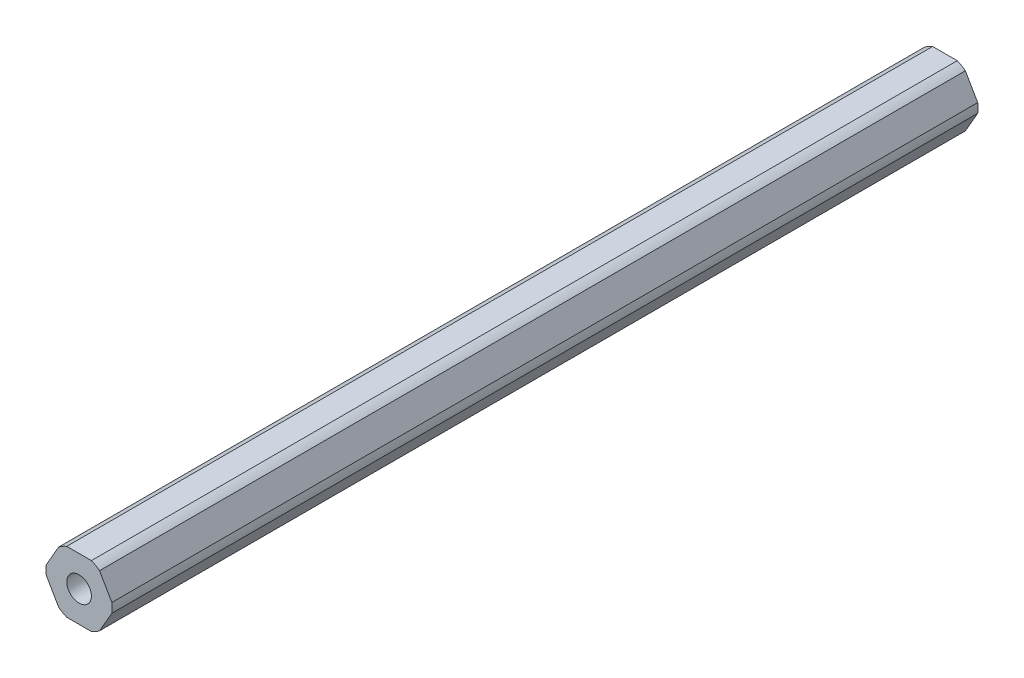
ISO-10303-21;
HEADER;
FILE_DESCRIPTION(('STEP AP214'),'2;1');
FILE_NAME('part.step','',(''),(''),'','','');
FILE_SCHEMA(('AUTOMOTIVE_DESIGN { 1 0 10303 214 1 1 1 1 }'));
ENDSEC;
DATA;
#1=APPLICATION_CONTEXT('core data for automotive mechanical design processes');
#2=APPLICATION_PROTOCOL_DEFINITION('international standard','automotive_design',2000,#1);
#3=PRODUCT_CONTEXT('',#1,'mechanical');
#4=PRODUCT('Part','Part','',(#3));
#5=PRODUCT_RELATED_PRODUCT_CATEGORY('part','',(#4));
#6=PRODUCT_DEFINITION_FORMATION('','',#4);
#7=PRODUCT_DEFINITION_CONTEXT('part definition',#1,'design');
#8=PRODUCT_DEFINITION('design','',#6,#7);
#9=PRODUCT_DEFINITION_SHAPE('','',#8);
#10=(LENGTH_UNIT() NAMED_UNIT(*) SI_UNIT(.MILLI.,.METRE.));
#11=(NAMED_UNIT(*) PLANE_ANGLE_UNIT() SI_UNIT($,.RADIAN.));
#12=(NAMED_UNIT(*) SI_UNIT($,.STERADIAN.) SOLID_ANGLE_UNIT());
#13=UNCERTAINTY_MEASURE_WITH_UNIT(LENGTH_MEASURE(1.E-05),#10,'distance_accuracy_value','');
#14=(GEOMETRIC_REPRESENTATION_CONTEXT(3) GLOBAL_UNCERTAINTY_ASSIGNED_CONTEXT((#13)) GLOBAL_UNIT_ASSIGNED_CONTEXT((#10,
#11,#12)) REPRESENTATION_CONTEXT('',''));
#15=CARTESIAN_POINT('',(0.,0.,0.));
#16=DIRECTION('',(0.,0.,1.));
#17=DIRECTION('',(1.,0.,0.));
#18=AXIS2_PLACEMENT_3D('',#15,#16,#17);
#19=CARTESIAN_POINT('',(0.,0.,-457.2));
#20=DIRECTION('',(0.,0.,1.));
#21=DIRECTION('',(1.,0.,0.));
#22=AXIS2_PLACEMENT_3D('',#19,#20,#21);
#23=CYLINDRICAL_SURFACE('',#22,6.87);
#24=CARTESIAN_POINT('',(0.,0.,277.588702492338));
#25=DIRECTION('',(0.,0.,1.));
#26=DIRECTION('',(1.,0.,0.));
#27=AXIS2_PLACEMENT_3D('',#24,#25,#26);
#28=CIRCLE('',#27,6.87);
#29=CARTESIAN_POINT('',(6.80102150534208,0.97108520937895,277.588702492338));
#30=VERTEX_POINT('',#29);
#31=CARTESIAN_POINT('',(6.80102150534208,-0.971085209378955,277.588702492338));
#32=VERTEX_POINT('',#31);
#33=EDGE_CURVE('E205',#30,#32,#28,.F.);
#34=ORIENTED_EDGE('',*,*,#33,.F.);
#35=DIRECTION('',(0.,0.,1.));
#36=VECTOR('',#35,1.);
#37=CARTESIAN_POINT('',(6.80102150534208,0.97108520937895,457.2));
#38=LINE('',#37,#36);
#39=CARTESIAN_POINT('',(6.80102150534208,0.971085209378948,457.2));
#40=VERTEX_POINT('',#39);
#41=EDGE_CURVE('E184',#30,#40,#38,.T.);
#42=ORIENTED_EDGE('',*,*,#41,.T.);
#43=CARTESIAN_POINT('',(0.,0.,457.2));
#44=DIRECTION('',(0.,0.,1.));
#45=DIRECTION('',(1.,0.,0.));
#46=AXIS2_PLACEMENT_3D('',#43,#44,#45);
#47=CIRCLE('',#46,6.87);
#48=CARTESIAN_POINT('',(6.80102150534208,-0.971085209378954,457.2));
#49=VERTEX_POINT('',#48);
#50=EDGE_CURVE('E234',#40,#49,#47,.F.);
#51=ORIENTED_EDGE('',*,*,#50,.T.);
#52=DIRECTION('',(0.,0.,1.));
#53=VECTOR('',#52,1.);
#54=CARTESIAN_POINT('',(6.80102150534208,-0.971085209378955,457.2));
#55=LINE('',#54,#53);
#56=EDGE_CURVE('E264',#49,#32,#55,.F.);
#57=ORIENTED_EDGE('',*,*,#56,.T.);
#58=EDGE_LOOP('',(#34,#42,#51,#57));
#59=FACE_BOUND('',#58,.T.);
#60=ADVANCED_FACE('F56',(#59),#23,.T.);
#61=CARTESIAN_POINT('',(3.68083890619154,6.3754,457.2));
#62=DIRECTION('',(0.,-1.,0.));
#63=DIRECTION('',(1.,0.,0.));
#64=AXIS2_PLACEMENT_3D('',#61,#62,#63);
#65=PLANE('',#64);
#66=DIRECTION('',(0.,0.,1.));
#67=VECTOR('',#66,1.);
#68=CARTESIAN_POINT('',(2.55952629210953,6.37540000000001,-457.2));
#69=LINE('',#68,#67);
#70=CARTESIAN_POINT('',(2.55952629210953,6.37540000000001,277.588702492338));
#71=VERTEX_POINT('',#70);
#72=CARTESIAN_POINT('',(2.55952629210953,6.37540000000001,457.2));
#73=VERTEX_POINT('',#72);
#74=EDGE_CURVE('E183',#71,#73,#69,.T.);
#75=ORIENTED_EDGE('',*,*,#74,.F.);
#76=DIRECTION('',(-1.,0.,0.));
#77=VECTOR('',#76,1.);
#78=CARTESIAN_POINT('',(3.68083890619154,6.3754,277.588702492338));
#79=LINE('',#78,#77);
#80=CARTESIAN_POINT('',(-2.55952629210953,6.37540000000001,277.588702492338));
#81=VERTEX_POINT('',#80);
#82=EDGE_CURVE('E76',#71,#81,#79,.T.);
#83=ORIENTED_EDGE('',*,*,#82,.T.);
#84=DIRECTION('',(0.,0.,1.));
#85=VECTOR('',#84,1.);
#86=CARTESIAN_POINT('',(-2.55952629210953,6.37540000000001,-457.2));
#87=LINE('',#86,#85);
#88=CARTESIAN_POINT('',(-2.55952629210953,6.37540000000001,457.2));
#89=VERTEX_POINT('',#88);
#90=EDGE_CURVE('E289',#89,#81,#87,.F.);
#91=ORIENTED_EDGE('',*,*,#90,.F.);
#92=DIRECTION('',(1.,0.,0.));
#93=VECTOR('',#92,1.);
#94=CARTESIAN_POINT('',(0.,6.3754,457.2));
#95=LINE('',#94,#93);
#96=EDGE_CURVE('E251',#73,#89,#95,.F.);
#97=ORIENTED_EDGE('',*,*,#96,.F.);
#98=EDGE_LOOP('',(#75,#83,#91,#97));
#99=FACE_BOUND('',#98,.T.);
#100=ADVANCED_FACE('F345',(#99),#65,.F.);
#101=CARTESIAN_POINT('',(0.,0.,-457.2));
#102=DIRECTION('',(0.,0.,1.));
#103=DIRECTION('',(1.,0.,0.));
#104=AXIS2_PLACEMENT_3D('',#101,#102,#103);
#105=CYLINDRICAL_SURFACE('',#104,6.87);
#106=CARTESIAN_POINT('',(0.,0.,277.588702492338));
#107=DIRECTION('',(0.,0.,1.));
#108=DIRECTION('',(1.,0.,0.));
#109=AXIS2_PLACEMENT_3D('',#106,#107,#108);
#110=CIRCLE('',#109,6.87);
#111=CARTESIAN_POINT('',(-4.24149521323255,5.40431479062104,277.588702492338));
#112=VERTEX_POINT('',#111);
#113=EDGE_CURVE('E84',#112,#81,#110,.F.);
#114=ORIENTED_EDGE('',*,*,#113,.F.);
#115=DIRECTION('',(0.,0.,1.));
#116=VECTOR('',#115,1.);
#117=CARTESIAN_POINT('',(-4.24149521323255,5.40431479062104,457.2));
#118=LINE('',#117,#116);
#119=CARTESIAN_POINT('',(-4.24149521323255,5.40431479062105,457.2));
#120=VERTEX_POINT('',#119);
#121=EDGE_CURVE('E286',#112,#120,#118,.T.);
#122=ORIENTED_EDGE('',*,*,#121,.T.);
#123=CARTESIAN_POINT('',(0.,0.,457.2));
#124=DIRECTION('',(0.,0.,1.));
#125=DIRECTION('',(1.,0.,0.));
#126=AXIS2_PLACEMENT_3D('',#123,#124,#125);
#127=CIRCLE('',#126,6.87);
#128=EDGE_CURVE('E250',#89,#120,#127,.T.);
#129=ORIENTED_EDGE('',*,*,#128,.F.);
#130=ORIENTED_EDGE('',*,*,#90,.T.);
#131=EDGE_LOOP('',(#114,#122,#129,#130));
#132=FACE_BOUND('',#131,.T.);
#133=ADVANCED_FACE('F343',(#132),#105,.T.);
#134=CARTESIAN_POINT('',(-3.68083890619154,6.3754,457.2));
#135=DIRECTION('',(0.866025403784439,-0.5,0.));
#136=DIRECTION('',(0.5,0.866025403784439,0.));
#137=AXIS2_PLACEMENT_3D('',#134,#135,#136);
#138=PLANE('',#137);
#139=ORIENTED_EDGE('',*,*,#121,.F.);
#140=DIRECTION('',(-0.5,-0.866025403784439,0.));
#141=VECTOR('',#140,1.);
#142=CARTESIAN_POINT('',(-3.68083890619154,6.3754,277.588702492338));
#143=LINE('',#142,#141);
#144=CARTESIAN_POINT('',(-6.80102150534208,0.971085209378959,277.588702492338));
#145=VERTEX_POINT('',#144);
#146=EDGE_CURVE('E229',#112,#145,#143,.T.);
#147=ORIENTED_EDGE('',*,*,#146,.T.);
#148=DIRECTION('',(0.,0.,1.));
#149=VECTOR('',#148,1.);
#150=CARTESIAN_POINT('',(-6.80102150534208,0.971085209378959,-457.2));
#151=LINE('',#150,#149);
#152=CARTESIAN_POINT('',(-6.80102150534208,0.971085209378961,457.2));
#153=VERTEX_POINT('',#152);
#154=EDGE_CURVE('E282',#153,#145,#151,.F.);
#155=ORIENTED_EDGE('',*,*,#154,.F.);
#156=DIRECTION('',(-0.5,-0.866025403784439,0.));
#157=VECTOR('',#156,1.);
#158=CARTESIAN_POINT('',(-4.24149521323255,5.40431479062104,457.2));
#159=LINE('',#158,#157);
#160=EDGE_CURVE('E247',#120,#153,#159,.T.);
#161=ORIENTED_EDGE('',*,*,#160,.F.);
#162=EDGE_LOOP('',(#139,#147,#155,#161));
#163=FACE_BOUND('',#162,.T.);
#164=ADVANCED_FACE('F341',(#163),#138,.F.);
#165=CARTESIAN_POINT('',(0.,0.,-457.2));
#166=DIRECTION('',(0.,0.,1.));
#167=DIRECTION('',(1.,0.,0.));
#168=AXIS2_PLACEMENT_3D('',#165,#166,#167);
#169=CYLINDRICAL_SURFACE('',#168,6.87);
#170=CARTESIAN_POINT('',(0.,0.,277.588702492338));
#171=DIRECTION('',(0.,0.,1.));
#172=DIRECTION('',(1.,0.,0.));
#173=AXIS2_PLACEMENT_3D('',#170,#171,#172);
#174=CIRCLE('',#173,6.87);
#175=CARTESIAN_POINT('',(-6.80102150534208,-0.971085209378956,277.588702492338));
#176=VERTEX_POINT('',#175);
#177=EDGE_CURVE('E225',#176,#145,#174,.F.);
#178=ORIENTED_EDGE('',*,*,#177,.F.);
#179=DIRECTION('',(0.,0.,1.));
#180=VECTOR('',#179,1.);
#181=CARTESIAN_POINT('',(-6.80102150534208,-0.971085209378956,457.2));
#182=LINE('',#181,#180);
#183=CARTESIAN_POINT('',(-6.80102150534208,-0.971085209378955,457.2));
#184=VERTEX_POINT('',#183);
#185=EDGE_CURVE('E279',#176,#184,#182,.T.);
#186=ORIENTED_EDGE('',*,*,#185,.T.);
#187=CARTESIAN_POINT('',(0.,0.,457.2));
#188=DIRECTION('',(0.,0.,1.));
#189=DIRECTION('',(1.,0.,0.));
#190=AXIS2_PLACEMENT_3D('',#187,#188,#189);
#191=CIRCLE('',#190,6.87);
#192=EDGE_CURVE('E246',#153,#184,#191,.T.);
#193=ORIENTED_EDGE('',*,*,#192,.F.);
#194=ORIENTED_EDGE('',*,*,#154,.T.);
#195=EDGE_LOOP('',(#178,#186,#193,#194));
#196=FACE_BOUND('',#195,.T.);
#197=ADVANCED_FACE('F337',(#196),#169,.T.);
#198=CARTESIAN_POINT('',(-7.36167781238308,0.,457.2));
#199=DIRECTION('',(0.866025403784439,0.5,0.));
#200=DIRECTION('',(-0.5,0.866025403784439,0.));
#201=AXIS2_PLACEMENT_3D('',#198,#199,#200);
#202=PLANE('',#201);
#203=ORIENTED_EDGE('',*,*,#185,.F.);
#204=DIRECTION('',(0.5,-0.866025403784439,0.));
#205=VECTOR('',#204,1.);
#206=CARTESIAN_POINT('',(-7.36167781238308,0.,277.588702492338));
#207=LINE('',#206,#205);
#208=CARTESIAN_POINT('',(-4.24149521323255,-5.40431479062105,277.588702492338));
#209=VERTEX_POINT('',#208);
#210=EDGE_CURVE('E222',#176,#209,#207,.T.);
#211=ORIENTED_EDGE('',*,*,#210,.T.);
#212=DIRECTION('',(0.,0.,1.));
#213=VECTOR('',#212,1.);
#214=CARTESIAN_POINT('',(-4.24149521323255,-5.40431479062105,-457.2));
#215=LINE('',#214,#213);
#216=CARTESIAN_POINT('',(-4.24149521323255,-5.40431479062105,457.2));
#217=VERTEX_POINT('',#216);
#218=EDGE_CURVE('E275',#217,#209,#215,.F.);
#219=ORIENTED_EDGE('',*,*,#218,.F.);
#220=DIRECTION('',(0.5,-0.866025403784439,0.));
#221=VECTOR('',#220,1.);
#222=CARTESIAN_POINT('',(-6.80102150534208,-0.971085209378956,457.2));
#223=LINE('',#222,#221);
#224=EDGE_CURVE('E243',#184,#217,#223,.T.);
#225=ORIENTED_EDGE('',*,*,#224,.F.);
#226=EDGE_LOOP('',(#203,#211,#219,#225));
#227=FACE_BOUND('',#226,.T.);
#228=ADVANCED_FACE('F335',(#227),#202,.F.);
#229=CARTESIAN_POINT('',(0.,0.,-457.2));
#230=DIRECTION('',(0.,0.,1.));
#231=DIRECTION('',(1.,0.,0.));
#232=AXIS2_PLACEMENT_3D('',#229,#230,#231);
#233=CYLINDRICAL_SURFACE('',#232,6.87);
#234=CARTESIAN_POINT('',(0.,0.,277.588702492338));
#235=DIRECTION('',(0.,0.,1.));
#236=DIRECTION('',(1.,0.,0.));
#237=AXIS2_PLACEMENT_3D('',#234,#235,#236);
#238=CIRCLE('',#237,6.87);
#239=CARTESIAN_POINT('',(-2.55952629210953,-6.3754,277.588702492338));
#240=VERTEX_POINT('',#239);
#241=EDGE_CURVE('E218',#240,#209,#238,.F.);
#242=ORIENTED_EDGE('',*,*,#241,.F.);
#243=DIRECTION('',(0.,0.,1.));
#244=VECTOR('',#243,1.);
#245=CARTESIAN_POINT('',(-2.55952629210953,-6.3754,457.2));
#246=LINE('',#245,#244);
#247=CARTESIAN_POINT('',(-2.55952629210953,-6.3754,457.2));
#248=VERTEX_POINT('',#247);
#249=EDGE_CURVE('E272',#240,#248,#246,.T.);
#250=ORIENTED_EDGE('',*,*,#249,.T.);
#251=CARTESIAN_POINT('',(0.,0.,457.2));
#252=DIRECTION('',(0.,0.,1.));
#253=DIRECTION('',(1.,0.,0.));
#254=AXIS2_PLACEMENT_3D('',#251,#252,#253);
#255=CIRCLE('',#254,6.87);
#256=EDGE_CURVE('E242',#217,#248,#255,.T.);
#257=ORIENTED_EDGE('',*,*,#256,.F.);
#258=ORIENTED_EDGE('',*,*,#218,.T.);
#259=EDGE_LOOP('',(#242,#250,#257,#258));
#260=FACE_BOUND('',#259,.T.);
#261=ADVANCED_FACE('F329',(#260),#233,.T.);
#262=CARTESIAN_POINT('',(-3.68083890619154,-6.3754,457.2));
#263=DIRECTION('',(0.,1.,0.));
#264=DIRECTION('',(0.,0.,1.));
#265=AXIS2_PLACEMENT_3D('',#262,#263,#264);
#266=PLANE('',#265);
#267=ORIENTED_EDGE('',*,*,#249,.F.);
#268=DIRECTION('',(1.,0.,0.));
#269=VECTOR('',#268,1.);
#270=CARTESIAN_POINT('',(-3.68083890619154,-6.3754,277.588702492338));
#271=LINE('',#270,#269);
#272=CARTESIAN_POINT('',(2.55952629210953,-6.3754,277.588702492338));
#273=VERTEX_POINT('',#272);
#274=EDGE_CURVE('E215',#240,#273,#271,.T.);
#275=ORIENTED_EDGE('',*,*,#274,.T.);
#276=DIRECTION('',(0.,0.,1.));
#277=VECTOR('',#276,1.);
#278=CARTESIAN_POINT('',(2.55952629210953,-6.3754,-457.2));
#279=LINE('',#278,#277);
#280=CARTESIAN_POINT('',(2.55952629210953,-6.3754,457.2));
#281=VERTEX_POINT('',#280);
#282=EDGE_CURVE('E268',#281,#273,#279,.F.);
#283=ORIENTED_EDGE('',*,*,#282,.F.);
#284=DIRECTION('',(1.,0.,0.));
#285=VECTOR('',#284,1.);
#286=CARTESIAN_POINT('',(0.,-6.3754,457.2));
#287=LINE('',#286,#285);
#288=EDGE_CURVE('E239',#248,#281,#287,.T.);
#289=ORIENTED_EDGE('',*,*,#288,.F.);
#290=EDGE_LOOP('',(#267,#275,#283,#289));
#291=FACE_BOUND('',#290,.T.);
#292=ADVANCED_FACE('F326',(#291),#266,.F.);
#293=CARTESIAN_POINT('',(0.,0.,-457.2));
#294=DIRECTION('',(0.,0.,1.));
#295=DIRECTION('',(1.,0.,0.));
#296=AXIS2_PLACEMENT_3D('',#293,#294,#295);
#297=CYLINDRICAL_SURFACE('',#296,6.87);
#298=CARTESIAN_POINT('',(0.,0.,277.588702492338));
#299=DIRECTION('',(0.,0.,1.));
#300=DIRECTION('',(1.,0.,0.));
#301=AXIS2_PLACEMENT_3D('',#298,#299,#300);
#302=CIRCLE('',#301,6.87);
#303=CARTESIAN_POINT('',(4.24149521323254,-5.40431479062105,277.588702492338));
#304=VERTEX_POINT('',#303);
#305=EDGE_CURVE('E211',#304,#273,#302,.F.);
#306=ORIENTED_EDGE('',*,*,#305,.F.);
#307=DIRECTION('',(0.,0.,1.));
#308=VECTOR('',#307,1.);
#309=CARTESIAN_POINT('',(4.24149521323254,-5.40431479062105,457.2));
#310=LINE('',#309,#308);
#311=CARTESIAN_POINT('',(4.24149521323254,-5.40431479062105,457.2));
#312=VERTEX_POINT('',#311);
#313=EDGE_CURVE('E261',#304,#312,#310,.T.);
#314=ORIENTED_EDGE('',*,*,#313,.T.);
#315=CARTESIAN_POINT('',(0.,0.,457.2));
#316=DIRECTION('',(0.,0.,1.));
#317=DIRECTION('',(1.,0.,0.));
#318=AXIS2_PLACEMENT_3D('',#315,#316,#317);
#319=CIRCLE('',#318,6.87);
#320=EDGE_CURVE('E238',#281,#312,#319,.T.);
#321=ORIENTED_EDGE('',*,*,#320,.F.);
#322=ORIENTED_EDGE('',*,*,#282,.T.);
#323=EDGE_LOOP('',(#306,#314,#321,#322));
#324=FACE_BOUND('',#323,.T.);
#325=ADVANCED_FACE('F321',(#324),#297,.T.);
#326=CARTESIAN_POINT('',(3.68083890619154,-6.3754,457.2));
#327=DIRECTION('',(-0.866025403784439,0.5,0.));
#328=DIRECTION('',(-0.5,-0.866025403784439,0.));
#329=AXIS2_PLACEMENT_3D('',#326,#327,#328);
#330=PLANE('',#329);
#331=ORIENTED_EDGE('',*,*,#313,.F.);
#332=DIRECTION('',(0.5,0.866025403784439,0.));
#333=VECTOR('',#332,1.);
#334=CARTESIAN_POINT('',(3.68083890619154,-6.3754,277.588702492338));
#335=LINE('',#334,#333);
#336=EDGE_CURVE('E208',#304,#32,#335,.T.);
#337=ORIENTED_EDGE('',*,*,#336,.T.);
#338=ORIENTED_EDGE('',*,*,#56,.F.);
#339=DIRECTION('',(0.5,0.866025403784439,0.));
#340=VECTOR('',#339,1.);
#341=CARTESIAN_POINT('',(4.24149521323254,-5.40431479062105,457.2));
#342=LINE('',#341,#340);
#343=EDGE_CURVE('E65',#312,#49,#342,.T.);
#344=ORIENTED_EDGE('',*,*,#343,.F.);
#345=EDGE_LOOP('',(#331,#337,#338,#344));
#346=FACE_BOUND('',#345,.T.);
#347=ADVANCED_FACE('F313',(#346),#330,.F.);
#348=CARTESIAN_POINT('',(7.36167781238308,0.,457.2));
#349=DIRECTION('',(-0.866025403784439,-0.5,0.));
#350=DIRECTION('',(0.5,-0.866025403784439,0.));
#351=AXIS2_PLACEMENT_3D('',#348,#349,#350);
#352=PLANE('',#351);
#353=ORIENTED_EDGE('',*,*,#41,.F.);
#354=DIRECTION('',(-0.5,0.866025403784439,0.));
#355=VECTOR('',#354,1.);
#356=CARTESIAN_POINT('',(7.36167781238308,0.,277.588702492338));
#357=LINE('',#356,#355);
#358=CARTESIAN_POINT('',(4.24149521323254,5.40431479062105,277.588702492338));
#359=VERTEX_POINT('',#358);
#360=EDGE_CURVE('E188',#30,#359,#357,.T.);
#361=ORIENTED_EDGE('',*,*,#360,.T.);
#362=DIRECTION('',(0.,0.,1.));
#363=VECTOR('',#362,1.);
#364=CARTESIAN_POINT('',(4.24149521323254,5.40431479062105,-457.2));
#365=LINE('',#364,#363);
#366=CARTESIAN_POINT('',(4.24149521323254,5.40431479062105,457.2));
#367=VERTEX_POINT('',#366);
#368=EDGE_CURVE('E173',#367,#359,#365,.F.);
#369=ORIENTED_EDGE('',*,*,#368,.F.);
#370=DIRECTION('',(-0.5,0.866025403784438,0.));
#371=VECTOR('',#370,1.);
#372=CARTESIAN_POINT('',(6.80102150534208,0.97108520937895,457.2));
#373=LINE('',#372,#371);
#374=EDGE_CURVE('E254',#40,#367,#373,.T.);
#375=ORIENTED_EDGE('',*,*,#374,.F.);
#376=EDGE_LOOP('',(#353,#361,#369,#375));
#377=FACE_BOUND('',#376,.T.);
#378=ADVANCED_FACE('F189',(#377),#352,.F.);
#379=CARTESIAN_POINT('',(0.,0.,-457.2));
#380=DIRECTION('',(0.,0.,1.));
#381=DIRECTION('',(1.,0.,0.));
#382=AXIS2_PLACEMENT_3D('',#379,#380,#381);
#383=CYLINDRICAL_SURFACE('',#382,6.87);
#384=CARTESIAN_POINT('',(0.,0.,277.588702492338));
#385=DIRECTION('',(0.,0.,1.));
#386=DIRECTION('',(1.,0.,0.));
#387=AXIS2_PLACEMENT_3D('',#384,#385,#386);
#388=CIRCLE('',#387,6.87);
#389=EDGE_CURVE('E177',#71,#359,#388,.F.);
#390=ORIENTED_EDGE('',*,*,#389,.F.);
#391=ORIENTED_EDGE('',*,*,#74,.T.);
#392=CARTESIAN_POINT('',(0.,0.,457.2));
#393=DIRECTION('',(0.,0.,1.));
#394=DIRECTION('',(1.,0.,0.));
#395=AXIS2_PLACEMENT_3D('',#392,#393,#394);
#396=CIRCLE('',#395,6.87);
#397=EDGE_CURVE('E179',#367,#73,#396,.T.);
#398=ORIENTED_EDGE('',*,*,#397,.F.);
#399=ORIENTED_EDGE('',*,*,#368,.T.);
#400=EDGE_LOOP('',(#390,#391,#398,#399));
#401=FACE_BOUND('',#400,.T.);
#402=ADVANCED_FACE('F175',(#401),#383,.T.);
#403=CARTESIAN_POINT('',(0.,0.,457.2));
#404=DIRECTION('',(0.,0.,1.));
#405=DIRECTION('',(1.,0.,0.));
#406=AXIS2_PLACEMENT_3D('',#403,#404,#405);
#407=PLANE('',#406);
#408=ORIENTED_EDGE('',*,*,#343,.T.);
#409=ORIENTED_EDGE('',*,*,#50,.F.);
#410=ORIENTED_EDGE('',*,*,#374,.T.);
#411=ORIENTED_EDGE('',*,*,#397,.T.);
#412=ORIENTED_EDGE('',*,*,#96,.T.);
#413=ORIENTED_EDGE('',*,*,#128,.T.);
#414=ORIENTED_EDGE('',*,*,#160,.T.);
#415=ORIENTED_EDGE('',*,*,#192,.T.);
#416=ORIENTED_EDGE('',*,*,#224,.T.);
#417=ORIENTED_EDGE('',*,*,#256,.T.);
#418=ORIENTED_EDGE('',*,*,#288,.T.);
#419=ORIENTED_EDGE('',*,*,#320,.T.);
#420=EDGE_LOOP('',(#408,#409,#410,#411,#412,#413,#414,#415,#416,#417,#418,#419));
#421=FACE_BOUND('',#420,.T.);
#422=CARTESIAN_POINT('',(0.,0.,457.2));
#423=DIRECTION('',(0.,0.,1.));
#424=DIRECTION('',(1.,0.,0.));
#425=AXIS2_PLACEMENT_3D('',#422,#423,#424);
#426=CIRCLE('',#425,2.55);
#427=CARTESIAN_POINT('',(2.55,0.,457.2));
#428=VERTEX_POINT('',#427);
#429=EDGE_CURVE('E14',#428,#428,#426,.F.);
#430=ORIENTED_EDGE('',*,*,#429,.T.);
#431=EDGE_LOOP('',(#430));
#432=FACE_BOUND('',#431,.T.);
#433=ADVANCED_FACE('F315',(#421,#432),#407,.T.);
#434=CARTESIAN_POINT('',(0.,0.,-457.2));
#435=DIRECTION('',(0.,0.,1.));
#436=DIRECTION('',(1.,0.,0.));
#437=AXIS2_PLACEMENT_3D('',#434,#435,#436);
#438=CYLINDRICAL_SURFACE('',#437,2.55);
#439=CARTESIAN_POINT('',(0.,0.,277.588702492338));
#440=DIRECTION('',(0.,0.,1.));
#441=DIRECTION('',(1.,0.,0.));
#442=AXIS2_PLACEMENT_3D('',#439,#440,#441);
#443=CIRCLE('',#442,2.55);
#444=CARTESIAN_POINT('',(2.55,0.,277.588702492338));
#445=VERTEX_POINT('',#444);
#446=EDGE_CURVE('E59',#445,#445,#443,.F.);
#447=ORIENTED_EDGE('',*,*,#446,.T.);
#448=EDGE_LOOP('',(#447));
#449=FACE_BOUND('',#448,.T.);
#450=ORIENTED_EDGE('',*,*,#429,.F.);
#451=EDGE_LOOP('',(#450));
#452=FACE_BOUND('',#451,.T.);
#453=ADVANCED_FACE('F352',(#449,#452),#438,.F.);
#454=CARTESIAN_POINT('',(0.,0.,277.588702492338));
#455=DIRECTION('',(0.,0.,1.));
#456=DIRECTION('',(1.,0.,0.));
#457=AXIS2_PLACEMENT_3D('',#454,#455,#456);
#458=PLANE('',#457);
#459=ORIENTED_EDGE('',*,*,#146,.F.);
#460=ORIENTED_EDGE('',*,*,#113,.T.);
#461=ORIENTED_EDGE('',*,*,#82,.F.);
#462=ORIENTED_EDGE('',*,*,#389,.T.);
#463=ORIENTED_EDGE('',*,*,#360,.F.);
#464=ORIENTED_EDGE('',*,*,#33,.T.);
#465=ORIENTED_EDGE('',*,*,#336,.F.);
#466=ORIENTED_EDGE('',*,*,#305,.T.);
#467=ORIENTED_EDGE('',*,*,#274,.F.);
#468=ORIENTED_EDGE('',*,*,#241,.T.);
#469=ORIENTED_EDGE('',*,*,#210,.F.);
#470=ORIENTED_EDGE('',*,*,#177,.T.);
#471=EDGE_LOOP('',(#459,#460,#461,#462,#463,#464,#465,#466,#467,#468,#469,#470));
#472=FACE_BOUND('',#471,.T.);
#473=ORIENTED_EDGE('',*,*,#446,.F.);
#474=EDGE_LOOP('',(#473));
#475=FACE_BOUND('',#474,.T.);
#476=ADVANCED_FACE('F195',(#472,#475),#458,.F.);
#477=CLOSED_SHELL('',(#60,#100,#133,#164,#197,#228,#261,#292,#325,#347,#378,#402,#433,#453,#476));
#478=MANIFOLD_SOLID_BREP('B2',#477);
#479=ADVANCED_BREP_SHAPE_REPRESENTATION('',(#18,#478),#14);
#480=SHAPE_DEFINITION_REPRESENTATION(#9,#479);
ENDSEC;
END-ISO-10303-21;
